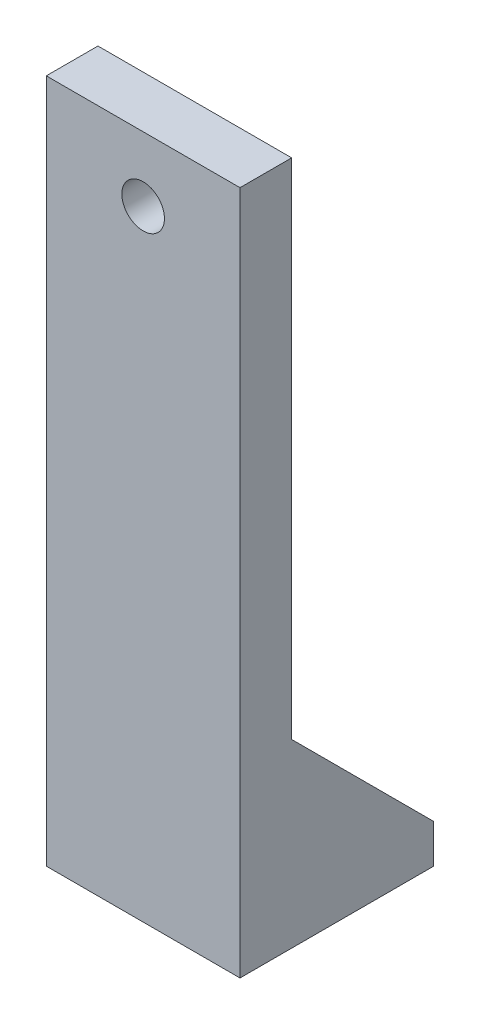
ISO-10303-21;
HEADER;
FILE_DESCRIPTION(('STEP AP214'),'2;1');
FILE_NAME('part.step','',(''),(''),'','','');
FILE_SCHEMA(('AUTOMOTIVE_DESIGN { 1 0 10303 214 1 1 1 1 }'));
ENDSEC;
DATA;
#1=APPLICATION_CONTEXT('core data for automotive mechanical design processes');
#2=APPLICATION_PROTOCOL_DEFINITION('international standard','automotive_design',2000,#1);
#3=PRODUCT_CONTEXT('',#1,'mechanical');
#4=PRODUCT('Part','Part','',(#3));
#5=PRODUCT_RELATED_PRODUCT_CATEGORY('part','',(#4));
#6=PRODUCT_DEFINITION_FORMATION('','',#4);
#7=PRODUCT_DEFINITION_CONTEXT('part definition',#1,'design');
#8=PRODUCT_DEFINITION('design','',#6,#7);
#9=PRODUCT_DEFINITION_SHAPE('','',#8);
#10=(LENGTH_UNIT() NAMED_UNIT(*) SI_UNIT(.MILLI.,.METRE.));
#11=(NAMED_UNIT(*) PLANE_ANGLE_UNIT() SI_UNIT($,.RADIAN.));
#12=(NAMED_UNIT(*) SI_UNIT($,.STERADIAN.) SOLID_ANGLE_UNIT());
#13=UNCERTAINTY_MEASURE_WITH_UNIT(LENGTH_MEASURE(1.E-05),#10,'distance_accuracy_value','');
#14=(GEOMETRIC_REPRESENTATION_CONTEXT(3) GLOBAL_UNCERTAINTY_ASSIGNED_CONTEXT((#13)) GLOBAL_UNIT_ASSIGNED_CONTEXT((#10,
#11,#12)) REPRESENTATION_CONTEXT('',''));
#15=CARTESIAN_POINT('',(0.,0.,0.));
#16=DIRECTION('',(0.,0.,1.));
#17=DIRECTION('',(1.,0.,0.));
#18=AXIS2_PLACEMENT_3D('',#15,#16,#17);
#19=CARTESIAN_POINT('',(0.,3.,0.));
#20=DIRECTION('',(0.,-1.,0.));
#21=DIRECTION('',(0.,0.,-1.));
#22=AXIS2_PLACEMENT_3D('',#19,#20,#21);
#23=PLANE('',#22);
#24=CARTESIAN_POINT('',(7.5,3.,-9.));
#25=DIRECTION('',(0.,1.,0.));
#26=DIRECTION('',(0.,0.,1.));
#27=AXIS2_PLACEMENT_3D('',#24,#25,#26);
#28=CIRCLE('',#27,2.65);
#29=CARTESIAN_POINT('',(7.5,3.,-6.35));
#30=VERTEX_POINT('',#29);
#31=EDGE_CURVE('E167',#30,#30,#28,.T.);
#32=ORIENTED_EDGE('',*,*,#31,.F.);
#33=EDGE_LOOP('',(#32));
#34=FACE_BOUND('',#33,.T.);
#35=DIRECTION('',(0.,0.,-1.));
#36=VECTOR('',#35,1.);
#37=CARTESIAN_POINT('',(3.,3.,-15.));
#38=LINE('',#37,#36);
#39=CARTESIAN_POINT('',(3.,3.,-4.));
#40=VERTEX_POINT('',#39);
#41=CARTESIAN_POINT('',(3.,3.,-15.));
#42=VERTEX_POINT('',#41);
#43=EDGE_CURVE('E118',#40,#42,#38,.T.);
#44=ORIENTED_EDGE('',*,*,#43,.F.);
#45=DIRECTION('',(-1.,0.,0.));
#46=VECTOR('',#45,1.);
#47=CARTESIAN_POINT('',(0.,3.,-4.));
#48=LINE('',#47,#46);
#49=CARTESIAN_POINT('',(12.,3.,-4.));
#50=VERTEX_POINT('',#49);
#51=EDGE_CURVE('E133',#50,#40,#48,.T.);
#52=ORIENTED_EDGE('',*,*,#51,.F.);
#53=DIRECTION('',(0.,0.,-1.));
#54=VECTOR('',#53,1.);
#55=CARTESIAN_POINT('',(12.,3.,-15.));
#56=LINE('',#55,#54);
#57=CARTESIAN_POINT('',(12.,3.,-15.));
#58=VERTEX_POINT('',#57);
#59=EDGE_CURVE('E55',#50,#58,#56,.T.);
#60=ORIENTED_EDGE('',*,*,#59,.T.);
#61=DIRECTION('',(-1.,0.,0.));
#62=VECTOR('',#61,1.);
#63=CARTESIAN_POINT('',(0.,3.,-15.));
#64=LINE('',#63,#62);
#65=EDGE_CURVE('E177',#58,#42,#64,.T.);
#66=ORIENTED_EDGE('',*,*,#65,.T.);
#67=EDGE_LOOP('',(#44,#52,#60,#66));
#68=FACE_BOUND('',#67,.T.);
#69=ADVANCED_FACE('F39',(#34,#68),#23,.F.);
#70=CARTESIAN_POINT('',(0.,53.,-4.));
#71=DIRECTION('',(0.,0.,1.));
#72=DIRECTION('',(1.,0.,0.));
#73=AXIS2_PLACEMENT_3D('',#70,#71,#72);
#74=PLANE('',#73);
#75=CARTESIAN_POINT('',(7.5,48.,-4.));
#76=DIRECTION('',(0.,0.,-1.));
#77=DIRECTION('',(-1.,0.,0.));
#78=AXIS2_PLACEMENT_3D('',#75,#76,#77);
#79=CIRCLE('',#78,1.65);
#80=CARTESIAN_POINT('',(5.85,48.,-4.));
#81=VERTEX_POINT('',#80);
#82=EDGE_CURVE('E137',#81,#81,#79,.T.);
#83=ORIENTED_EDGE('',*,*,#82,.F.);
#84=EDGE_LOOP('',(#83));
#85=FACE_BOUND('',#84,.T.);
#86=DIRECTION('',(-1.,0.,0.));
#87=VECTOR('',#86,1.);
#88=CARTESIAN_POINT('',(3.,13.9999999999999,-4.));
#89=LINE('',#88,#87);
#90=CARTESIAN_POINT('',(3.,13.9999999999999,-4.));
#91=VERTEX_POINT('',#90);
#92=CARTESIAN_POINT('',(0.,13.9999999999999,-4.));
#93=VERTEX_POINT('',#92);
#94=EDGE_CURVE('E123',#91,#93,#89,.T.);
#95=ORIENTED_EDGE('',*,*,#94,.T.);
#96=DIRECTION('',(0.,-1.,0.));
#97=VECTOR('',#96,1.);
#98=CARTESIAN_POINT('',(0.,53.,-4.));
#99=LINE('',#98,#97);
#100=CARTESIAN_POINT('',(0.,53.,-4.));
#101=VERTEX_POINT('',#100);
#102=EDGE_CURVE('E161',#101,#93,#99,.T.);
#103=ORIENTED_EDGE('',*,*,#102,.F.);
#104=DIRECTION('',(-1.,0.,0.));
#105=VECTOR('',#104,1.);
#106=CARTESIAN_POINT('',(0.,53.,-4.));
#107=LINE('',#106,#105);
#108=CARTESIAN_POINT('',(15.,53.,-4.));
#109=VERTEX_POINT('',#108);
#110=EDGE_CURVE('E159',#109,#101,#107,.T.);
#111=ORIENTED_EDGE('',*,*,#110,.F.);
#112=DIRECTION('',(0.,-1.,0.));
#113=VECTOR('',#112,1.);
#114=CARTESIAN_POINT('',(15.,53.,-4.));
#115=LINE('',#114,#113);
#116=CARTESIAN_POINT('',(15.,13.9999999999999,-4.));
#117=VERTEX_POINT('',#116);
#118=EDGE_CURVE('E164',#109,#117,#115,.T.);
#119=ORIENTED_EDGE('',*,*,#118,.T.);
#120=DIRECTION('',(1.,0.,0.));
#121=VECTOR('',#120,1.);
#122=CARTESIAN_POINT('',(12.,13.9999999999999,-4.));
#123=LINE('',#122,#121);
#124=CARTESIAN_POINT('',(12.,13.9999999999999,-4.));
#125=VERTEX_POINT('',#124);
#126=EDGE_CURVE('E63',#125,#117,#123,.T.);
#127=ORIENTED_EDGE('',*,*,#126,.F.);
#128=DIRECTION('',(0.,-1.,0.));
#129=VECTOR('',#128,1.);
#130=CARTESIAN_POINT('',(12.,3.,-4.));
#131=LINE('',#130,#129);
#132=EDGE_CURVE('E142',#125,#50,#131,.T.);
#133=ORIENTED_EDGE('',*,*,#132,.T.);
#134=ORIENTED_EDGE('',*,*,#51,.T.);
#135=DIRECTION('',(0.,-1.,0.));
#136=VECTOR('',#135,1.);
#137=CARTESIAN_POINT('',(3.,3.,-4.));
#138=LINE('',#137,#136);
#139=EDGE_CURVE('E116',#91,#40,#138,.T.);
#140=ORIENTED_EDGE('',*,*,#139,.F.);
#141=EDGE_LOOP('',(#95,#103,#111,#119,#127,#133,#134,#140));
#142=FACE_BOUND('',#141,.T.);
#143=ADVANCED_FACE('F132',(#85,#142),#74,.F.);
#144=CARTESIAN_POINT('',(0.,0.,0.));
#145=DIRECTION('',(0.,-1.,0.));
#146=DIRECTION('',(0.,0.,-1.));
#147=AXIS2_PLACEMENT_3D('',#144,#145,#146);
#148=PLANE('',#147);
#149=DIRECTION('',(0.,0.,1.));
#150=VECTOR('',#149,1.);
#151=CARTESIAN_POINT('',(0.,0.,0.));
#152=LINE('',#151,#150);
#153=CARTESIAN_POINT('',(0.,0.,-15.));
#154=VERTEX_POINT('',#153);
#155=CARTESIAN_POINT('',(0.,0.,0.));
#156=VERTEX_POINT('',#155);
#157=EDGE_CURVE('E170',#154,#156,#152,.T.);
#158=ORIENTED_EDGE('',*,*,#157,.F.);
#159=DIRECTION('',(-1.,0.,0.));
#160=VECTOR('',#159,1.);
#161=CARTESIAN_POINT('',(0.,0.,-15.));
#162=LINE('',#161,#160);
#163=CARTESIAN_POINT('',(15.,0.,-15.));
#164=VERTEX_POINT('',#163);
#165=EDGE_CURVE('E184',#164,#154,#162,.T.);
#166=ORIENTED_EDGE('',*,*,#165,.F.);
#167=DIRECTION('',(0.,0.,-1.));
#168=VECTOR('',#167,1.);
#169=CARTESIAN_POINT('',(15.,0.,0.));
#170=LINE('',#169,#168);
#171=CARTESIAN_POINT('',(15.,0.,0.));
#172=VERTEX_POINT('',#171);
#173=EDGE_CURVE('E182',#172,#164,#170,.T.);
#174=ORIENTED_EDGE('',*,*,#173,.F.);
#175=DIRECTION('',(1.,0.,0.));
#176=VECTOR('',#175,1.);
#177=CARTESIAN_POINT('',(0.,0.,0.));
#178=LINE('',#177,#176);
#179=EDGE_CURVE('E180',#156,#172,#178,.T.);
#180=ORIENTED_EDGE('',*,*,#179,.F.);
#181=EDGE_LOOP('',(#158,#166,#174,#180));
#182=FACE_BOUND('',#181,.T.);
#183=CARTESIAN_POINT('',(7.5,0.,-9.));
#184=DIRECTION('',(0.,1.,0.));
#185=DIRECTION('',(0.,0.,1.));
#186=AXIS2_PLACEMENT_3D('',#183,#184,#185);
#187=CIRCLE('',#186,2.65);
#188=CARTESIAN_POINT('',(7.5,0.,-6.35));
#189=VERTEX_POINT('',#188);
#190=EDGE_CURVE('E166',#189,#189,#187,.T.);
#191=ORIENTED_EDGE('',*,*,#190,.T.);
#192=EDGE_LOOP('',(#191));
#193=FACE_BOUND('',#192,.T.);
#194=ADVANCED_FACE('F202',(#182,#193),#148,.T.);
#195=CARTESIAN_POINT('',(0.,3.,0.));
#196=DIRECTION('',(1.,0.,0.));
#197=DIRECTION('',(0.,0.,-1.));
#198=AXIS2_PLACEMENT_3D('',#195,#196,#197);
#199=PLANE('',#198);
#200=ORIENTED_EDGE('',*,*,#157,.T.);
#201=DIRECTION('',(0.,-1.,0.));
#202=VECTOR('',#201,1.);
#203=CARTESIAN_POINT('',(0.,3.,0.));
#204=LINE('',#203,#202);
#205=CARTESIAN_POINT('',(0.,53.,0.));
#206=VERTEX_POINT('',#205);
#207=EDGE_CURVE('E11',#206,#156,#204,.T.);
#208=ORIENTED_EDGE('',*,*,#207,.F.);
#209=DIRECTION('',(0.,0.,1.));
#210=VECTOR('',#209,1.);
#211=CARTESIAN_POINT('',(0.,53.,0.));
#212=LINE('',#211,#210);
#213=EDGE_CURVE('E151',#101,#206,#212,.T.);
#214=ORIENTED_EDGE('',*,*,#213,.F.);
#215=ORIENTED_EDGE('',*,*,#102,.T.);
#216=DIRECTION('',(0.,0.707106781186543,0.707106781186551));
#217=VECTOR('',#216,1.);
#218=CARTESIAN_POINT('',(0.,13.9999999999999,-4.));
#219=LINE('',#218,#217);
#220=CARTESIAN_POINT('',(0.,3.,-15.));
#221=VERTEX_POINT('',#220);
#222=EDGE_CURVE('E126',#221,#93,#219,.T.);
#223=ORIENTED_EDGE('',*,*,#222,.F.);
#224=DIRECTION('',(0.,-1.,0.));
#225=VECTOR('',#224,1.);
#226=CARTESIAN_POINT('',(0.,3.,-15.));
#227=LINE('',#226,#225);
#228=EDGE_CURVE('E176',#221,#154,#227,.T.);
#229=ORIENTED_EDGE('',*,*,#228,.T.);
#230=EDGE_LOOP('',(#200,#208,#214,#215,#223,#229));
#231=FACE_BOUND('',#230,.T.);
#232=ADVANCED_FACE('F41',(#231),#199,.F.);
#233=CARTESIAN_POINT('',(0.,3.,0.));
#234=DIRECTION('',(0.,0.,-1.));
#235=DIRECTION('',(-1.,0.,0.));
#236=AXIS2_PLACEMENT_3D('',#233,#234,#235);
#237=PLANE('',#236);
#238=CARTESIAN_POINT('',(7.5,48.,0.));
#239=DIRECTION('',(0.,0.,-1.));
#240=DIRECTION('',(-1.,0.,0.));
#241=AXIS2_PLACEMENT_3D('',#238,#239,#240);
#242=CIRCLE('',#241,1.65);
#243=CARTESIAN_POINT('',(5.85,48.,0.));
#244=VERTEX_POINT('',#243);
#245=EDGE_CURVE('E43',#244,#244,#242,.T.);
#246=ORIENTED_EDGE('',*,*,#245,.T.);
#247=EDGE_LOOP('',(#246));
#248=FACE_BOUND('',#247,.T.);
#249=ORIENTED_EDGE('',*,*,#179,.T.);
#250=DIRECTION('',(0.,-1.,0.));
#251=VECTOR('',#250,1.);
#252=CARTESIAN_POINT('',(15.,3.,0.));
#253=LINE('',#252,#251);
#254=CARTESIAN_POINT('',(15.,53.,0.));
#255=VERTEX_POINT('',#254);
#256=EDGE_CURVE('E48',#255,#172,#253,.T.);
#257=ORIENTED_EDGE('',*,*,#256,.F.);
#258=DIRECTION('',(1.,0.,0.));
#259=VECTOR('',#258,1.);
#260=CARTESIAN_POINT('',(0.,53.,0.));
#261=LINE('',#260,#259);
#262=EDGE_CURVE('E154',#206,#255,#261,.T.);
#263=ORIENTED_EDGE('',*,*,#262,.F.);
#264=ORIENTED_EDGE('',*,*,#207,.T.);
#265=EDGE_LOOP('',(#249,#257,#263,#264));
#266=FACE_BOUND('',#265,.T.);
#267=ADVANCED_FACE('F236',(#248,#266),#237,.F.);
#268=CARTESIAN_POINT('',(15.,3.,0.));
#269=DIRECTION('',(-1.,0.,0.));
#270=DIRECTION('',(0.,0.,1.));
#271=AXIS2_PLACEMENT_3D('',#268,#269,#270);
#272=PLANE('',#271);
#273=DIRECTION('',(0.,-1.,0.));
#274=VECTOR('',#273,1.);
#275=CARTESIAN_POINT('',(15.,3.,-15.));
#276=LINE('',#275,#274);
#277=CARTESIAN_POINT('',(15.,3.,-15.));
#278=VERTEX_POINT('',#277);
#279=EDGE_CURVE('E188',#278,#164,#276,.T.);
#280=ORIENTED_EDGE('',*,*,#279,.F.);
#281=DIRECTION('',(0.,0.707106781186543,0.707106781186551));
#282=VECTOR('',#281,1.);
#283=CARTESIAN_POINT('',(15.,13.9999999999999,-4.));
#284=LINE('',#283,#282);
#285=EDGE_CURVE('E140',#278,#117,#284,.T.);
#286=ORIENTED_EDGE('',*,*,#285,.T.);
#287=ORIENTED_EDGE('',*,*,#118,.F.);
#288=DIRECTION('',(0.,0.,-1.));
#289=VECTOR('',#288,1.);
#290=CARTESIAN_POINT('',(15.,53.,0.));
#291=LINE('',#290,#289);
#292=EDGE_CURVE('E157',#255,#109,#291,.T.);
#293=ORIENTED_EDGE('',*,*,#292,.F.);
#294=ORIENTED_EDGE('',*,*,#256,.T.);
#295=ORIENTED_EDGE('',*,*,#173,.T.);
#296=EDGE_LOOP('',(#280,#286,#287,#293,#294,#295));
#297=FACE_BOUND('',#296,.T.);
#298=ADVANCED_FACE('F195',(#297),#272,.F.);
#299=CARTESIAN_POINT('',(0.,3.,-15.));
#300=DIRECTION('',(0.,0.,1.));
#301=DIRECTION('',(1.,0.,0.));
#302=AXIS2_PLACEMENT_3D('',#299,#300,#301);
#303=PLANE('',#302);
#304=ORIENTED_EDGE('',*,*,#165,.T.);
#305=ORIENTED_EDGE('',*,*,#228,.F.);
#306=DIRECTION('',(-1.,0.,0.));
#307=VECTOR('',#306,1.);
#308=CARTESIAN_POINT('',(3.,3.,-15.));
#309=LINE('',#308,#307);
#310=EDGE_CURVE('E129',#42,#221,#309,.T.);
#311=ORIENTED_EDGE('',*,*,#310,.F.);
#312=ORIENTED_EDGE('',*,*,#65,.F.);
#313=EDGE_CURVE('E173',#278,#58,#64,.T.);
#314=ORIENTED_EDGE('',*,*,#313,.F.);
#315=ORIENTED_EDGE('',*,*,#279,.T.);
#316=EDGE_LOOP('',(#304,#305,#311,#312,#314,#315));
#317=FACE_BOUND('',#316,.T.);
#318=ADVANCED_FACE('F206',(#317),#303,.F.);
#319=CARTESIAN_POINT('',(7.5,3.,-9.));
#320=DIRECTION('',(0.,-1.,0.));
#321=DIRECTION('',(0.,0.,-1.));
#322=AXIS2_PLACEMENT_3D('',#319,#320,#321);
#323=CYLINDRICAL_SURFACE('',#322,2.65);
#324=ORIENTED_EDGE('',*,*,#31,.T.);
#325=EDGE_LOOP('',(#324));
#326=FACE_BOUND('',#325,.T.);
#327=ORIENTED_EDGE('',*,*,#190,.F.);
#328=EDGE_LOOP('',(#327));
#329=FACE_BOUND('',#328,.T.);
#330=ADVANCED_FACE('F230',(#326,#329),#323,.F.);
#331=CARTESIAN_POINT('',(0.,53.,0.));
#332=DIRECTION('',(0.,-1.,0.));
#333=DIRECTION('',(0.,0.,-1.));
#334=AXIS2_PLACEMENT_3D('',#331,#332,#333);
#335=PLANE('',#334);
#336=ORIENTED_EDGE('',*,*,#213,.T.);
#337=ORIENTED_EDGE('',*,*,#262,.T.);
#338=ORIENTED_EDGE('',*,*,#292,.T.);
#339=ORIENTED_EDGE('',*,*,#110,.T.);
#340=EDGE_LOOP('',(#336,#337,#338,#339));
#341=FACE_BOUND('',#340,.T.);
#342=ADVANCED_FACE('F212',(#341),#335,.F.);
#343=CARTESIAN_POINT('',(12.,13.9999999999999,-4.));
#344=DIRECTION('',(0.,0.707106781186552,-0.707106781186543));
#345=DIRECTION('',(0.,0.707106781186543,0.707106781186552));
#346=AXIS2_PLACEMENT_3D('',#343,#344,#345);
#347=PLANE('',#346);
#348=ORIENTED_EDGE('',*,*,#285,.F.);
#349=ORIENTED_EDGE('',*,*,#313,.T.);
#350=DIRECTION('',(0.,0.707106781186543,0.707106781186551));
#351=VECTOR('',#350,1.);
#352=CARTESIAN_POINT('',(12.,13.9999999999999,-4.));
#353=LINE('',#352,#351);
#354=EDGE_CURVE('E145',#58,#125,#353,.T.);
#355=ORIENTED_EDGE('',*,*,#354,.T.);
#356=ORIENTED_EDGE('',*,*,#126,.T.);
#357=EDGE_LOOP('',(#348,#349,#355,#356));
#358=FACE_BOUND('',#357,.T.);
#359=ADVANCED_FACE('F215',(#358),#347,.T.);
#360=CARTESIAN_POINT('',(12.,0.,0.));
#361=DIRECTION('',(1.,0.,0.));
#362=DIRECTION('',(0.,0.,-1.));
#363=AXIS2_PLACEMENT_3D('',#360,#361,#362);
#364=PLANE('',#363);
#365=ORIENTED_EDGE('',*,*,#132,.F.);
#366=ORIENTED_EDGE('',*,*,#354,.F.);
#367=ORIENTED_EDGE('',*,*,#59,.F.);
#368=EDGE_LOOP('',(#365,#366,#367));
#369=FACE_BOUND('',#368,.T.);
#370=ADVANCED_FACE('F218',(#369),#364,.F.);
#371=CARTESIAN_POINT('',(3.,13.9999999999999,-4.));
#372=DIRECTION('',(0.,-0.707106781186552,0.707106781186543));
#373=DIRECTION('',(0.,-0.707106781186543,-0.707106781186552));
#374=AXIS2_PLACEMENT_3D('',#371,#372,#373);
#375=PLANE('',#374);
#376=ORIENTED_EDGE('',*,*,#222,.T.);
#377=ORIENTED_EDGE('',*,*,#94,.F.);
#378=DIRECTION('',(0.,0.707106781186543,0.707106781186551));
#379=VECTOR('',#378,1.);
#380=CARTESIAN_POINT('',(3.,13.9999999999999,-4.));
#381=LINE('',#380,#379);
#382=EDGE_CURVE('E112',#42,#91,#381,.T.);
#383=ORIENTED_EDGE('',*,*,#382,.F.);
#384=ORIENTED_EDGE('',*,*,#310,.T.);
#385=EDGE_LOOP('',(#376,#377,#383,#384));
#386=FACE_BOUND('',#385,.T.);
#387=ADVANCED_FACE('F124',(#386),#375,.F.);
#388=CARTESIAN_POINT('',(3.,0.,0.));
#389=DIRECTION('',(-1.,0.,0.));
#390=DIRECTION('',(0.,0.,-1.));
#391=AXIS2_PLACEMENT_3D('',#388,#389,#390);
#392=PLANE('',#391);
#393=ORIENTED_EDGE('',*,*,#139,.T.);
#394=ORIENTED_EDGE('',*,*,#43,.T.);
#395=ORIENTED_EDGE('',*,*,#382,.T.);
#396=EDGE_LOOP('',(#393,#394,#395));
#397=FACE_BOUND('',#396,.T.);
#398=ADVANCED_FACE('F114',(#397),#392,.F.);
#399=CARTESIAN_POINT('',(7.5,48.,9.));
#400=DIRECTION('',(0.,0.,-1.));
#401=DIRECTION('',(-1.,0.,0.));
#402=AXIS2_PLACEMENT_3D('',#399,#400,#401);
#403=CYLINDRICAL_SURFACE('',#402,1.65);
#404=ORIENTED_EDGE('',*,*,#82,.T.);
#405=EDGE_LOOP('',(#404));
#406=FACE_BOUND('',#405,.T.);
#407=ORIENTED_EDGE('',*,*,#245,.F.);
#408=EDGE_LOOP('',(#407));
#409=FACE_BOUND('',#408,.T.);
#410=ADVANCED_FACE('F248',(#406,#409),#403,.F.);
#411=CLOSED_SHELL('',(#69,#143,#194,#232,#267,#298,#318,#330,#342,#359,#370,#387,#398,#410));
#412=MANIFOLD_SOLID_BREP('B2',#411);
#413=ADVANCED_BREP_SHAPE_REPRESENTATION('',(#18,#412),#14);
#414=SHAPE_DEFINITION_REPRESENTATION(#9,#413);
ENDSEC;
END-ISO-10303-21;
